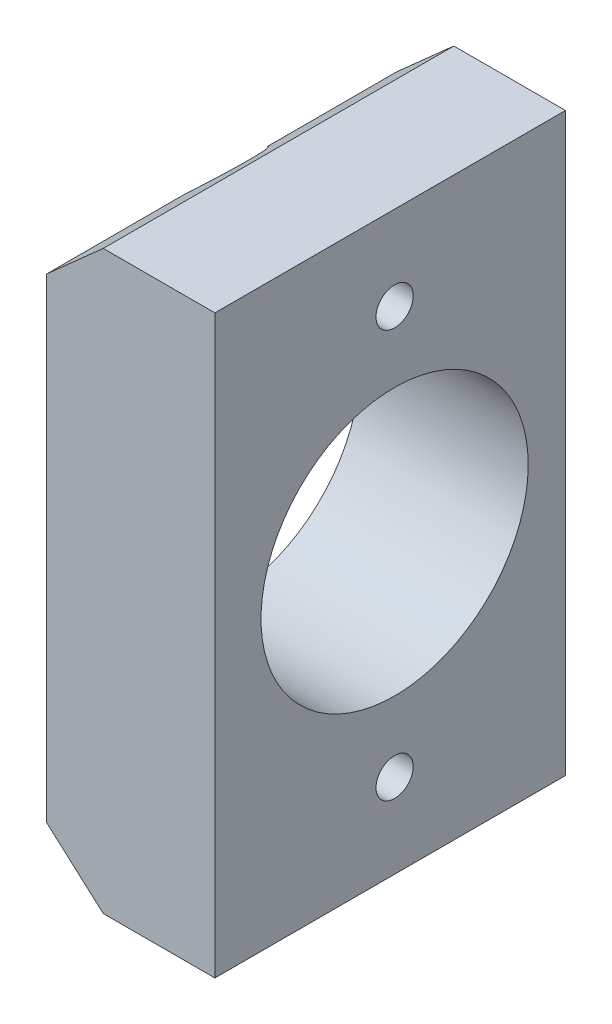
ISO-10303-21;
HEADER;
FILE_DESCRIPTION(('STEP AP214'),'2;1');
FILE_NAME('part.step','',(''),(''),'','','');
FILE_SCHEMA(('AUTOMOTIVE_DESIGN { 1 0 10303 214 1 1 1 1 }'));
ENDSEC;
DATA;
#1=APPLICATION_CONTEXT('core data for automotive mechanical design processes');
#2=APPLICATION_PROTOCOL_DEFINITION('international standard','automotive_design',2000,#1);
#3=PRODUCT_CONTEXT('',#1,'mechanical');
#4=PRODUCT('Part','Part','',(#3));
#5=PRODUCT_RELATED_PRODUCT_CATEGORY('part','',(#4));
#6=PRODUCT_DEFINITION_FORMATION('','',#4);
#7=PRODUCT_DEFINITION_CONTEXT('part definition',#1,'design');
#8=PRODUCT_DEFINITION('design','',#6,#7);
#9=PRODUCT_DEFINITION_SHAPE('','',#8);
#10=(LENGTH_UNIT() NAMED_UNIT(*) SI_UNIT(.MILLI.,.METRE.));
#11=(NAMED_UNIT(*) PLANE_ANGLE_UNIT() SI_UNIT($,.RADIAN.));
#12=(NAMED_UNIT(*) SI_UNIT($,.STERADIAN.) SOLID_ANGLE_UNIT());
#13=UNCERTAINTY_MEASURE_WITH_UNIT(LENGTH_MEASURE(1.E-05),#10,'distance_accuracy_value','');
#14=(GEOMETRIC_REPRESENTATION_CONTEXT(3) GLOBAL_UNCERTAINTY_ASSIGNED_CONTEXT((#13)) GLOBAL_UNIT_ASSIGNED_CONTEXT((#10,
#11,#12)) REPRESENTATION_CONTEXT('',''));
#15=CARTESIAN_POINT('',(0.,0.,0.));
#16=DIRECTION('',(0.,0.,1.));
#17=DIRECTION('',(1.,0.,0.));
#18=AXIS2_PLACEMENT_3D('',#15,#16,#17);
#19=CARTESIAN_POINT('',(-36.0193432780177,46.6615568790222,35.4120187443499));
#20=DIRECTION('',(-1.10762290173338E-08,1.,5.23479530495468E-10));
#21=DIRECTION('',(-1.75075260523792E-08,-5.23479717812036E-10,1.));
#22=AXIS2_PLACEMENT_3D('',#19,#20,#21);
#23=PLANE('',#22);
#24=DIRECTION('',(1.,1.10762290079716E-08,1.75075260578653E-08));
#25=VECTOR('',#24,1.);
#26=CARTESIAN_POINT('',(-36.0193429404726,46.6615568891149,16.1320187443498));
#27=LINE('',#26,#25);
#28=CARTESIAN_POINT('',(-29.6193429404726,46.6615569600028,16.132018856398));
#29=VERTEX_POINT('',#28);
#30=CARTESIAN_POINT('',(-17.0193429404726,46.6615570995633,16.1320190769928));
#31=VERTEX_POINT('',#30);
#32=EDGE_CURVE('E165',#29,#31,#27,.T.);
#33=ORIENTED_EDGE('',*,*,#32,.F.);
#34=DIRECTION('',(-1.75075260520672E-08,-5.23479724412836E-10,1.));
#35=VECTOR('',#34,1.);
#36=CARTESIAN_POINT('',(-29.6193432780177,46.6615569499101,35.412018856398));
#37=LINE('',#36,#35);
#38=CARTESIAN_POINT('',(-29.6193436330703,46.6615569392939,55.692018856398));
#39=VERTEX_POINT('',#38);
#40=EDGE_CURVE('E183',#29,#39,#37,.T.);
#41=ORIENTED_EDGE('',*,*,#40,.T.);
#42=DIRECTION('',(1.,1.10762290079716E-08,1.75075260578653E-08));
#43=VECTOR('',#42,1.);
#44=CARTESIAN_POINT('',(-72.0193436330703,46.6615564696618,55.6920181140789));
#45=LINE('',#44,#43);
#46=CARTESIAN_POINT('',(-17.0193436330703,46.6615570788544,55.6920190769928));
#47=VERTEX_POINT('',#46);
#48=EDGE_CURVE('E128',#39,#47,#45,.T.);
#49=ORIENTED_EDGE('',*,*,#48,.T.);
#50=DIRECTION('',(-1.75075260523792E-08,-5.23479717812036E-10,1.));
#51=VECTOR('',#50,1.);
#52=CARTESIAN_POINT('',(-17.0193432780177,46.6615570894706,35.4120190769928));
#53=LINE('',#52,#51);
#54=EDGE_CURVE('E137',#31,#47,#53,.T.);
#55=ORIENTED_EDGE('',*,*,#54,.F.);
#56=EDGE_LOOP('',(#33,#41,#49,#55));
#57=FACE_BOUND('',#56,.T.);
#58=ADVANCED_FACE('F51',(#57),#23,.T.);
#59=CARTESIAN_POINT('',(-36.0193425580628,-18.3384431209778,35.4120187103237));
#60=DIRECTION('',(-1.10762290173338E-08,1.,5.23479530495468E-10));
#61=DIRECTION('',(-1.75075260523792E-08,-5.23479717812036E-10,1.));
#62=AXIS2_PLACEMENT_3D('',#59,#60,#61);
#63=PLANE('',#62);
#64=DIRECTION('',(1.,1.10762290079716E-08,1.75075260578653E-08));
#65=VECTOR('',#64,1.);
#66=CARTESIAN_POINT('',(-72.0193429131154,-18.3384435303382,55.6920180800527));
#67=LINE('',#66,#65);
#68=CARTESIAN_POINT('',(-29.6193429131154,-18.3384430607061,55.6920188223718));
#69=VERTEX_POINT('',#68);
#70=CARTESIAN_POINT('',(-17.0193429131154,-18.3384429211456,55.6920190429667));
#71=VERTEX_POINT('',#70);
#72=EDGE_CURVE('E116',#69,#71,#67,.T.);
#73=ORIENTED_EDGE('',*,*,#72,.F.);
#74=DIRECTION('',(1.75075260520672E-08,5.23479724412836E-10,-1.));
#75=VECTOR('',#74,1.);
#76=CARTESIAN_POINT('',(-29.6193422205177,-18.3384430399972,16.1320188223718));
#77=LINE('',#76,#75);
#78=CARTESIAN_POINT('',(-29.6193422205177,-18.3384430399972,16.1320188223718));
#79=VERTEX_POINT('',#78);
#80=EDGE_CURVE('E179',#69,#79,#77,.T.);
#81=ORIENTED_EDGE('',*,*,#80,.T.);
#82=DIRECTION('',(1.,1.10762290079716E-08,1.75075260578653E-08));
#83=VECTOR('',#82,1.);
#84=CARTESIAN_POINT('',(-36.0193422205177,-18.3384431108851,16.1320187103237));
#85=LINE('',#84,#83);
#86=CARTESIAN_POINT('',(-17.0193422205177,-18.3384429004367,16.1320190429667));
#87=VERTEX_POINT('',#86);
#88=EDGE_CURVE('E141',#79,#87,#85,.T.);
#89=ORIENTED_EDGE('',*,*,#88,.T.);
#90=DIRECTION('',(-1.75075260523792E-08,-5.23479717812036E-10,1.));
#91=VECTOR('',#90,1.);
#92=CARTESIAN_POINT('',(-17.0193425580628,-18.3384429105294,35.4120190429667));
#93=LINE('',#92,#91);
#94=EDGE_CURVE('E134',#87,#71,#93,.T.);
#95=ORIENTED_EDGE('',*,*,#94,.T.);
#96=EDGE_LOOP('',(#73,#81,#89,#95));
#97=FACE_BOUND('',#96,.T.);
#98=ADVANCED_FACE('F139',(#97),#63,.F.);
#99=CARTESIAN_POINT('',(-36.019342663287,-8.83844312097775,35.4120187152967));
#100=DIRECTION('',(1.,1.10762290079716E-08,1.75075260578653E-08));
#101=DIRECTION('',(-1.75075260523791E-08,-5.23479912944036E-10,1.));
#102=AXIS2_PLACEMENT_3D('',#99,#100,#101);
#103=CYLINDRICAL_SURFACE('',#102,2.1);
#104=CARTESIAN_POINT('',(-17.019342663287,-8.8384429105294,35.4120190479397));
#105=DIRECTION('',(-1.,-1.10762290079716E-08,-1.75075260578653E-08));
#106=DIRECTION('',(1.75075260523791E-08,5.23479912944036E-10,-1.));
#107=AXIS2_PLACEMENT_3D('',#104,#105,#106);
#108=CIRCLE('',#107,2.1);
#109=CARTESIAN_POINT('',(-17.0193426265212,-8.83844290943009,33.3120190479397));
#110=VERTEX_POINT('',#109);
#111=EDGE_CURVE('E155',#110,#110,#108,.T.);
#112=ORIENTED_EDGE('',*,*,#111,.F.);
#113=EDGE_LOOP('',(#112));
#114=FACE_BOUND('',#113,.T.);
#115=CARTESIAN_POINT('',(-26.019342663287,-8.83844301021546,35.412018890372));
#116=DIRECTION('',(-1.,-1.10762290079716E-08,-1.75075260578653E-08));
#117=DIRECTION('',(1.75075260523791E-08,5.23479912944036E-10,-1.));
#118=AXIS2_PLACEMENT_3D('',#115,#116,#117);
#119=CIRCLE('',#118,2.1);
#120=CARTESIAN_POINT('',(-26.0193426265212,-8.83844300911615,33.312018890372));
#121=VERTEX_POINT('',#120);
#122=EDGE_CURVE('E142',#121,#121,#119,.T.);
#123=ORIENTED_EDGE('',*,*,#122,.T.);
#124=EDGE_LOOP('',(#123));
#125=FACE_BOUND('',#124,.T.);
#126=ADVANCED_FACE('F245',(#114,#125),#103,.F.);
#127=CARTESIAN_POINT('',(-36.0193431727935,37.1615568790222,35.4120187393768));
#128=DIRECTION('',(1.,1.10762290079716E-08,1.75075260578653E-08));
#129=DIRECTION('',(-1.75075260523791E-08,-5.23479912944036E-10,1.));
#130=AXIS2_PLACEMENT_3D('',#127,#128,#129);
#131=CYLINDRICAL_SURFACE('',#130,2.1);
#132=CARTESIAN_POINT('',(-17.0193431727935,37.1615570894706,35.4120190720198));
#133=DIRECTION('',(-1.,-1.10762290079716E-08,-1.75075260578653E-08));
#134=DIRECTION('',(1.75075260523791E-08,5.23479912944036E-10,-1.));
#135=AXIS2_PLACEMENT_3D('',#132,#133,#134);
#136=CIRCLE('',#135,2.1);
#137=CARTESIAN_POINT('',(-17.0193431360277,37.1615570905699,33.3120190720198));
#138=VERTEX_POINT('',#137);
#139=EDGE_CURVE('E144',#138,#138,#136,.T.);
#140=ORIENTED_EDGE('',*,*,#139,.F.);
#141=EDGE_LOOP('',(#140));
#142=FACE_BOUND('',#141,.T.);
#143=CARTESIAN_POINT('',(-26.0193431727935,37.1615569897845,35.4120189144521));
#144=DIRECTION('',(-1.,-1.10762290079716E-08,-1.75075260578653E-08));
#145=DIRECTION('',(1.75075260523791E-08,5.23479912944036E-10,-1.));
#146=AXIS2_PLACEMENT_3D('',#143,#144,#145);
#147=CIRCLE('',#146,2.1);
#148=CARTESIAN_POINT('',(-26.0193431360277,37.1615569908838,33.3120189144521));
#149=VERTEX_POINT('',#148);
#150=EDGE_CURVE('E147',#149,#149,#147,.T.);
#151=ORIENTED_EDGE('',*,*,#150,.T.);
#152=EDGE_LOOP('',(#151));
#153=FACE_BOUND('',#152,.T.);
#154=ADVANCED_FACE('F248',(#142,#153),#131,.F.);
#155=CARTESIAN_POINT('',(-17.019342926794,14.1615570892089,35.9120190599797));
#156=DIRECTION('',(-1.,-1.10762290079716E-08,-1.75075260578653E-08));
#157=DIRECTION('',(1.10762290173338E-08,-1.,-5.23479725627468E-10));
#158=AXIS2_PLACEMENT_3D('',#155,#156,#157);
#159=PLANE('',#158);
#160=CARTESIAN_POINT('',(-17.0193429180402,14.1615570894706,35.4120190599798));
#161=DIRECTION('',(-1.,-1.10762290079716E-08,-1.75075260578653E-08));
#162=DIRECTION('',(1.75075260523791E-08,5.23479912944036E-10,-1.));
#163=AXIS2_PLACEMENT_3D('',#160,#161,#162);
#164=CIRCLE('',#163,15.075);
#165=CARTESIAN_POINT('',(-17.0193426541143,14.1615570973621,20.3370190599798));
#166=VERTEX_POINT('',#165);
#167=EDGE_CURVE('E158',#166,#166,#164,.T.);
#168=ORIENTED_EDGE('',*,*,#167,.T.);
#169=EDGE_LOOP('',(#168));
#170=FACE_BOUND('',#169,.T.);
#171=ORIENTED_EDGE('',*,*,#111,.T.);
#172=EDGE_LOOP('',(#171));
#173=FACE_BOUND('',#172,.T.);
#174=ORIENTED_EDGE('',*,*,#139,.T.);
#175=EDGE_LOOP('',(#174));
#176=FACE_BOUND('',#175,.T.);
#177=ORIENTED_EDGE('',*,*,#54,.T.);
#178=DIRECTION('',(1.10762290173338E-08,-1.,-5.23479725627468E-10));
#179=VECTOR('',#178,1.);
#180=CARTESIAN_POINT('',(-17.0193432730929,14.1615570788544,55.6920190599797));
#181=LINE('',#180,#179);
#182=EDGE_CURVE('E120',#47,#71,#181,.T.);
#183=ORIENTED_EDGE('',*,*,#182,.T.);
#184=ORIENTED_EDGE('',*,*,#94,.F.);
#185=DIRECTION('',(-1.10762290173338E-08,1.,5.23479138490291E-10));
#186=VECTOR('',#185,1.);
#187=CARTESIAN_POINT('',(-17.0193425804951,14.1615570995633,16.1320190599798));
#188=LINE('',#187,#186);
#189=EDGE_CURVE('E161',#87,#31,#188,.T.);
#190=ORIENTED_EDGE('',*,*,#189,.T.);
#191=EDGE_LOOP('',(#177,#183,#184,#190));
#192=FACE_BOUND('',#191,.T.);
#193=ADVANCED_FACE('F132',(#170,#173,#176,#192),#159,.F.);
#194=CARTESIAN_POINT('',(-36.0193425804951,14.1615568891149,16.1320187273368));
#195=DIRECTION('',(1.75075260523792E-08,5.2347932580686E-10,-1.));
#196=DIRECTION('',(-1.10762290173338E-08,1.,5.23479138490291E-10));
#197=AXIS2_PLACEMENT_3D('',#194,#195,#196);
#198=PLANE('',#197);
#199=DIRECTION('',(-1.10762290173338E-08,1.,5.23479138490291E-10));
#200=VECTOR('',#199,1.);
#201=CARTESIAN_POINT('',(-36.0193425804951,14.1615568891149,16.1320187273368));
#202=LINE('',#201,#200);
#203=CARTESIAN_POINT('',(-36.0193422836522,-12.6384431108851,16.1320187133075));
#204=VERTEX_POINT('',#203);
#205=CARTESIAN_POINT('',(-36.0193428773381,40.9615568891149,16.132018741366));
#206=VERTEX_POINT('',#205);
#207=EDGE_CURVE('E150',#204,#206,#202,.T.);
#208=ORIENTED_EDGE('',*,*,#207,.T.);
#209=DIRECTION('',(-0.746765197321267,-0.665087768696531,-1.34221708438718E-08));
#210=VECTOR('',#209,1.);
#211=CARTESIAN_POINT('',(-49.3299486003547,29.1067984026775,16.1320185021245));
#212=LINE('',#211,#210);
#213=EDGE_CURVE('E13',#206,#29,#212,.F.);
#214=ORIENTED_EDGE('',*,*,#213,.T.);
#215=ORIENTED_EDGE('',*,*,#32,.T.);
#216=ORIENTED_EDGE('',*,*,#189,.F.);
#217=ORIENTED_EDGE('',*,*,#88,.F.);
#218=DIRECTION('',(-0.746765212054595,0.665087752153846,-1.27258517169564E-08));
#219=VECTOR('',#218,1.);
#220=CARTESIAN_POINT('',(-49.3299482692809,-0.783684919310237,16.1320184864775));
#221=LINE('',#220,#219);
#222=EDGE_CURVE('E181',#79,#204,#221,.T.);
#223=ORIENTED_EDGE('',*,*,#222,.T.);
#224=EDGE_LOOP('',(#208,#214,#215,#216,#217,#223));
#225=FACE_BOUND('',#224,.T.);
#226=ADVANCED_FACE('F199',(#225),#198,.T.);
#227=CARTESIAN_POINT('',(-36.0193429180402,14.1615568790222,35.4120187273368));
#228=DIRECTION('',(1.,1.10762290079716E-08,1.75075260578653E-08));
#229=DIRECTION('',(-1.75075260523791E-08,-5.23479912944036E-10,1.));
#230=AXIS2_PLACEMENT_3D('',#227,#228,#229);
#231=CYLINDRICAL_SURFACE('',#230,15.075);
#232=CARTESIAN_POINT('',(-36.0193429180402,14.1615568790222,35.4120187273368));
#233=DIRECTION('',(-1.,-1.10762290079716E-08,-1.75075260578653E-08));
#234=DIRECTION('',(1.75075260523791E-08,5.23479912944036E-10,-1.));
#235=AXIS2_PLACEMENT_3D('',#232,#233,#234);
#236=CIRCLE('',#235,15.075);
#237=CARTESIAN_POINT('',(-36.0193426541143,14.1615568869137,20.3370187273368));
#238=VERTEX_POINT('',#237);
#239=EDGE_CURVE('E163',#238,#238,#236,.T.);
#240=ORIENTED_EDGE('',*,*,#239,.T.);
#241=EDGE_LOOP('',(#240));
#242=FACE_BOUND('',#241,.T.);
#243=ORIENTED_EDGE('',*,*,#167,.F.);
#244=EDGE_LOOP('',(#243));
#245=FACE_BOUND('',#244,.T.);
#246=ADVANCED_FACE('F309',(#242,#245),#231,.F.);
#247=CARTESIAN_POINT('',(-36.019342926794,14.1615568787605,35.9120187273368));
#248=DIRECTION('',(-1.,-1.10762290079716E-08,-1.75075260578653E-08));
#249=DIRECTION('',(1.10762290173338E-08,-1.,-5.23479725627468E-10));
#250=AXIS2_PLACEMENT_3D('',#247,#248,#249);
#251=PLANE('',#250);
#252=DIRECTION('',(1.10762290173338E-08,-1.,-5.23479458746933E-10));
#253=VECTOR('',#252,1.);
#254=CARTESIAN_POINT('',(-36.0193432730929,14.1615568684061,55.6920187273368));
#255=LINE('',#254,#253);
#256=CARTESIAN_POINT('',(-36.0193435699358,40.9615568684061,55.692018741366));
#257=VERTEX_POINT('',#256);
#258=CARTESIAN_POINT('',(-36.0193429762499,-12.6384431315939,55.6920187133075));
#259=VERTEX_POINT('',#258);
#260=EDGE_CURVE('E202',#257,#259,#255,.T.);
#261=ORIENTED_EDGE('',*,*,#260,.F.);
#262=DIRECTION('',(1.75075260520672E-08,5.23479724412836E-10,-1.));
#263=VECTOR('',#262,1.);
#264=CARTESIAN_POINT('',(-36.0193432236369,40.9615568787605,35.912018741366));
#265=LINE('',#264,#263);
#266=CARTESIAN_POINT('',(-36.0193432961754,40.9615568765916,40.0552934478636));
#267=VERTEX_POINT('',#266);
#268=EDGE_CURVE('E72',#257,#267,#265,.T.);
#269=ORIENTED_EDGE('',*,*,#268,.T.);
#270=CARTESIAN_POINT('',(-36.0193431727935,37.1615568790222,35.4120187393768));
#271=DIRECTION('',(-1.,-1.10762290079716E-08,-1.75075260578653E-08));
#272=DIRECTION('',(1.75075260523791E-08,5.23479912944036E-10,-1.));
#273=AXIS2_PLACEMENT_3D('',#270,#271,#272);
#274=CIRCLE('',#273,6.);
#275=CARTESIAN_POINT('',(-36.0193431335909,40.9615568814529,30.7687440348685));
#276=VERTEX_POINT('',#275);
#277=EDGE_CURVE('E127',#276,#267,#274,.T.);
#278=ORIENTED_EDGE('',*,*,#277,.F.);
#279=DIRECTION('',(1.75075260520672E-08,5.23479724412836E-10,-1.));
#280=VECTOR('',#279,1.);
#281=CARTESIAN_POINT('',(-36.0193432236369,40.9615568787605,35.912018741366));
#282=LINE('',#281,#280);
#283=EDGE_CURVE('E188',#276,#206,#282,.T.);
#284=ORIENTED_EDGE('',*,*,#283,.T.);
#285=ORIENTED_EDGE('',*,*,#207,.F.);
#286=DIRECTION('',(-1.75075260520672E-08,-5.23479724412836E-10,1.));
#287=VECTOR('',#286,1.);
#288=CARTESIAN_POINT('',(-36.0193429762499,-12.6384431315939,55.6920187133075));
#289=LINE('',#288,#287);
#290=CARTESIAN_POINT('',(-36.0193425399051,-12.6384431185471,30.7687440068099));
#291=VERTEX_POINT('',#290);
#292=EDGE_CURVE('E173',#204,#291,#289,.T.);
#293=ORIENTED_EDGE('',*,*,#292,.T.);
#294=CARTESIAN_POINT('',(-36.019342663287,-8.83844312097775,35.4120187152967));
#295=DIRECTION('',(-1.,-1.10762290079716E-08,-1.75075260578653E-08));
#296=DIRECTION('',(1.75075260523791E-08,5.23479912944036E-10,-1.));
#297=AXIS2_PLACEMENT_3D('',#294,#295,#296);
#298=CIRCLE('',#297,6.);
#299=CARTESIAN_POINT('',(-36.0193427024896,-12.6384431234084,40.0552934198051));
#300=VERTEX_POINT('',#299);
#301=EDGE_CURVE('E209',#300,#291,#298,.T.);
#302=ORIENTED_EDGE('',*,*,#301,.F.);
#303=DIRECTION('',(-1.75075260520672E-08,-5.23479724412836E-10,1.));
#304=VECTOR('',#303,1.);
#305=CARTESIAN_POINT('',(-36.0193429762499,-12.6384431315939,55.6920187133075));
#306=LINE('',#305,#304);
#307=EDGE_CURVE('E167',#300,#259,#306,.T.);
#308=ORIENTED_EDGE('',*,*,#307,.T.);
#309=EDGE_LOOP('',(#261,#269,#278,#284,#285,#293,#302,#308));
#310=FACE_BOUND('',#309,.T.);
#311=ORIENTED_EDGE('',*,*,#239,.F.);
#312=EDGE_LOOP('',(#311));
#313=FACE_BOUND('',#312,.T.);
#314=ADVANCED_FACE('F193',(#310,#313),#251,.T.);
#315=CARTESIAN_POINT('',(-26.0193431727935,37.1615569897845,35.4120189144521));
#316=DIRECTION('',(-1.,-1.10762290079716E-08,-1.75075260578653E-08));
#317=DIRECTION('',(1.75075260523791E-08,5.23479912944036E-10,-1.));
#318=AXIS2_PLACEMENT_3D('',#315,#316,#317);
#319=CYLINDRICAL_SURFACE('',#318,6.);
#320=CARTESIAN_POINT('',(-26.0193431727935,37.1615569897845,35.4120189144521));
#321=DIRECTION('',(-1.,-1.10762290079716E-08,-1.75075260578653E-08));
#322=DIRECTION('',(1.75075260523791E-08,5.23479912944036E-10,-1.));
#323=AXIS2_PLACEMENT_3D('',#320,#321,#322);
#324=CIRCLE('',#323,6.);
#325=CARTESIAN_POINT('',(-26.0193430677484,37.1615569929254,29.4120189144521));
#326=VERTEX_POINT('',#325);
#327=EDGE_CURVE('E212',#326,#326,#324,.T.);
#328=ORIENTED_EDGE('',*,*,#327,.F.);
#329=EDGE_LOOP('',(#328));
#330=FACE_BOUND('',#329,.T.);
#331=ORIENTED_EDGE('',*,*,#277,.T.);
#332=CARTESIAN_POINT('',(-40.2860098394602,37.1615568317637,35.412018664678));
#333=DIRECTION('',(0.66508776869653,-0.746765197321267,1.12531249976709E-08));
#334=DIRECTION('',(-0.746765197321267,-0.665087768696531,-1.34221711087468E-08));
#335=AXIS2_PLACEMENT_3D('',#332,#333,#334);
#336=ELLIPSE('',#335,9.02136583623825,6.);
#337=EDGE_CURVE('E60',#267,#276,#336,.F.);
#338=ORIENTED_EDGE('',*,*,#337,.T.);
#339=EDGE_LOOP('',(#331,#338));
#340=FACE_BOUND('',#339,.T.);
#341=ADVANCED_FACE('F236',(#330,#340),#319,.F.);
#342=CARTESIAN_POINT('',(-26.019342926794,14.1615569895228,35.912018902412));
#343=DIRECTION('',(-1.,-1.10762290079716E-08,-1.75075260578653E-08));
#344=DIRECTION('',(1.10762290173338E-08,-1.,-5.23479725627468E-10));
#345=AXIS2_PLACEMENT_3D('',#342,#343,#344);
#346=PLANE('',#345);
#347=ORIENTED_EDGE('',*,*,#150,.F.);
#348=EDGE_LOOP('',(#347));
#349=FACE_BOUND('',#348,.T.);
#350=ORIENTED_EDGE('',*,*,#327,.T.);
#351=EDGE_LOOP('',(#350));
#352=FACE_BOUND('',#351,.T.);
#353=ADVANCED_FACE('F225',(#349,#352),#346,.T.);
#354=CARTESIAN_POINT('',(-26.019342663287,-8.83844301021546,35.412018890372));
#355=DIRECTION('',(-1.,-1.10762290079716E-08,-1.75075260578653E-08));
#356=DIRECTION('',(1.75075260523791E-08,5.23479912944036E-10,-1.));
#357=AXIS2_PLACEMENT_3D('',#354,#355,#356);
#358=CYLINDRICAL_SURFACE('',#357,6.);
#359=CARTESIAN_POINT('',(-26.019342663287,-8.83844301021546,35.412018890372));
#360=DIRECTION('',(-1.,-1.10762290079716E-08,-1.75075260578653E-08));
#361=DIRECTION('',(1.75075260523791E-08,5.23479912944036E-10,-1.));
#362=AXIS2_PLACEMENT_3D('',#359,#360,#361);
#363=CIRCLE('',#362,6.);
#364=CARTESIAN_POINT('',(-26.0193425582418,-8.83844300707458,29.412018890372));
#365=VERTEX_POINT('',#364);
#366=EDGE_CURVE('E169',#365,#365,#363,.T.);
#367=ORIENTED_EDGE('',*,*,#366,.F.);
#368=EDGE_LOOP('',(#367));
#369=FACE_BOUND('',#368,.T.);
#370=ORIENTED_EDGE('',*,*,#301,.T.);
#371=CARTESIAN_POINT('',(-40.2860093299536,-8.83844316823633,35.4120186405979));
#372=DIRECTION('',(-0.665087752153846,-0.746765212054595,-1.20349575951517E-08));
#373=DIRECTION('',(-0.746765212054595,0.665087752153847,-1.27258514516154E-08));
#374=AXIS2_PLACEMENT_3D('',#371,#372,#373);
#375=ELLIPSE('',#374,9.02136583623824,6.);
#376=EDGE_CURVE('E176',#291,#300,#375,.T.);
#377=ORIENTED_EDGE('',*,*,#376,.T.);
#378=EDGE_LOOP('',(#370,#377));
#379=FACE_BOUND('',#378,.T.);
#380=ADVANCED_FACE('F222',(#369,#379),#358,.F.);
#381=CARTESIAN_POINT('',(-26.019342926794,14.1615569895228,35.912018902412));
#382=DIRECTION('',(-1.,-1.10762290079716E-08,-1.75075260578653E-08));
#383=DIRECTION('',(1.10762290173338E-08,-1.,-5.23479725627468E-10));
#384=AXIS2_PLACEMENT_3D('',#381,#382,#383);
#385=PLANE('',#384);
#386=ORIENTED_EDGE('',*,*,#122,.F.);
#387=EDGE_LOOP('',(#386));
#388=FACE_BOUND('',#387,.T.);
#389=ORIENTED_EDGE('',*,*,#366,.T.);
#390=EDGE_LOOP('',(#389));
#391=FACE_BOUND('',#390,.T.);
#392=ADVANCED_FACE('F224',(#388,#391),#385,.T.);
#393=CARTESIAN_POINT('',(-16.0193432730929,14.1615570899307,55.6920190774873));
#394=DIRECTION('',(-1.75075260523791E-08,-5.23479912944036E-10,1.));
#395=DIRECTION('',(1.10762290173338E-08,-1.,-5.23479725627468E-10));
#396=AXIS2_PLACEMENT_3D('',#393,#394,#395);
#397=PLANE('',#396);
#398=ORIENTED_EDGE('',*,*,#48,.F.);
#399=DIRECTION('',(0.746765197321267,0.665087768696531,1.34221712343695E-08));
#400=VECTOR('',#399,1.);
#401=CARTESIAN_POINT('',(-38.1767839843237,39.0400864564907,55.6920187025887));
#402=LINE('',#401,#400);
#403=EDGE_CURVE('E186',#39,#257,#402,.F.);
#404=ORIENTED_EDGE('',*,*,#403,.T.);
#405=ORIENTED_EDGE('',*,*,#260,.T.);
#406=DIRECTION('',(0.746765212054595,-0.665087752153846,1.27258513264586E-08));
#407=VECTOR('',#406,1.);
#408=CARTESIAN_POINT('',(-38.1767834332031,-10.7169727674711,55.6920186765419));
#409=LINE('',#408,#407);
#410=EDGE_CURVE('E123',#259,#69,#409,.T.);
#411=ORIENTED_EDGE('',*,*,#410,.T.);
#412=ORIENTED_EDGE('',*,*,#72,.T.);
#413=ORIENTED_EDGE('',*,*,#182,.F.);
#414=EDGE_LOOP('',(#398,#404,#405,#411,#412,#413));
#415=FACE_BOUND('',#414,.T.);
#416=ADVANCED_FACE('F119',(#415),#397,.T.);
#417=CARTESIAN_POINT('',(-36.0193426299511,-12.6384431212395,35.9120187133075));
#418=DIRECTION('',(-0.665087752153846,-0.746765212054595,-1.20349575951517E-08));
#419=DIRECTION('',(1.75075260520672E-08,5.23479724412836E-10,-1.));
#420=AXIS2_PLACEMENT_3D('',#417,#418,#419);
#421=PLANE('',#420);
#422=ORIENTED_EDGE('',*,*,#222,.F.);
#423=ORIENTED_EDGE('',*,*,#80,.F.);
#424=ORIENTED_EDGE('',*,*,#410,.F.);
#425=ORIENTED_EDGE('',*,*,#307,.F.);
#426=ORIENTED_EDGE('',*,*,#376,.F.);
#427=ORIENTED_EDGE('',*,*,#292,.F.);
#428=EDGE_LOOP('',(#422,#423,#424,#425,#426,#427));
#429=FACE_BOUND('',#428,.T.);
#430=ADVANCED_FACE('F220',(#429),#421,.T.);
#431=CARTESIAN_POINT('',(-29.6193432780177,46.6615569499101,35.412018856398));
#432=DIRECTION('',(0.66508776869653,-0.746765197321267,1.12531249976709E-08));
#433=DIRECTION('',(-1.75075260520672E-08,-5.23479724412836E-10,1.));
#434=AXIS2_PLACEMENT_3D('',#431,#432,#433);
#435=PLANE('',#434);
#436=ORIENTED_EDGE('',*,*,#337,.F.);
#437=ORIENTED_EDGE('',*,*,#268,.F.);
#438=ORIENTED_EDGE('',*,*,#403,.F.);
#439=ORIENTED_EDGE('',*,*,#40,.F.);
#440=ORIENTED_EDGE('',*,*,#213,.F.);
#441=ORIENTED_EDGE('',*,*,#283,.F.);
#442=EDGE_LOOP('',(#436,#437,#438,#439,#440,#441));
#443=FACE_BOUND('',#442,.T.);
#444=ADVANCED_FACE('F54',(#443),#435,.F.);
#445=CLOSED_SHELL('',(#58,#98,#126,#154,#193,#226,#246,#314,#341,#353,#380,#392,#416,#430,#444));
#446=MANIFOLD_SOLID_BREP('B2',#445);
#447=ADVANCED_BREP_SHAPE_REPRESENTATION('',(#18,#446),#14);
#448=SHAPE_DEFINITION_REPRESENTATION(#9,#447);
ENDSEC;
END-ISO-10303-21;
